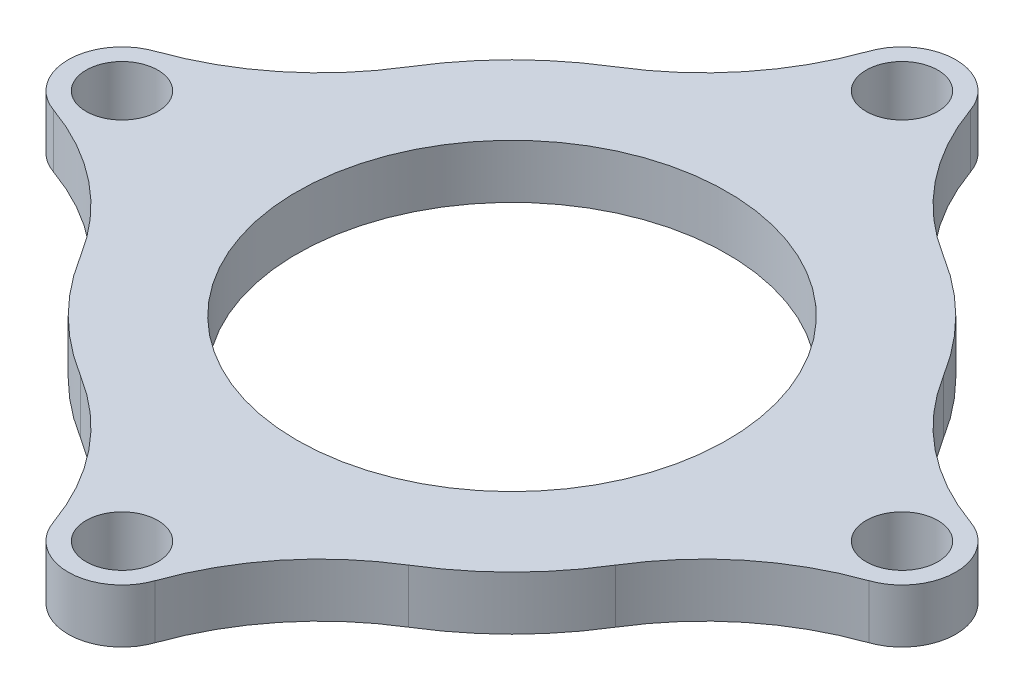
ISO-10303-21;
HEADER;
FILE_DESCRIPTION(('STEP AP214'),'2;1');
FILE_NAME('part.step','',(''),(''),'','','');
FILE_SCHEMA(('AUTOMOTIVE_DESIGN { 1 0 10303 214 1 1 1 1 }'));
ENDSEC;
DATA;
#1=APPLICATION_CONTEXT('core data for automotive mechanical design processes');
#2=APPLICATION_PROTOCOL_DEFINITION('international standard','automotive_design',2000,#1);
#3=PRODUCT_CONTEXT('',#1,'mechanical');
#4=PRODUCT('Part','Part','',(#3));
#5=PRODUCT_RELATED_PRODUCT_CATEGORY('part','',(#4));
#6=PRODUCT_DEFINITION_FORMATION('','',#4);
#7=PRODUCT_DEFINITION_CONTEXT('part definition',#1,'design');
#8=PRODUCT_DEFINITION('design','',#6,#7);
#9=PRODUCT_DEFINITION_SHAPE('','',#8);
#10=(LENGTH_UNIT() NAMED_UNIT(*) SI_UNIT(.MILLI.,.METRE.));
#11=(NAMED_UNIT(*) PLANE_ANGLE_UNIT() SI_UNIT($,.RADIAN.));
#12=(NAMED_UNIT(*) SI_UNIT($,.STERADIAN.) SOLID_ANGLE_UNIT());
#13=UNCERTAINTY_MEASURE_WITH_UNIT(LENGTH_MEASURE(1.E-05),#10,'distance_accuracy_value','');
#14=(GEOMETRIC_REPRESENTATION_CONTEXT(3) GLOBAL_UNCERTAINTY_ASSIGNED_CONTEXT((#13)) GLOBAL_UNIT_ASSIGNED_CONTEXT((#10,
#11,#12)) REPRESENTATION_CONTEXT('',''));
#15=CARTESIAN_POINT('',(0.,0.,0.));
#16=DIRECTION('',(0.,0.,1.));
#17=DIRECTION('',(1.,0.,0.));
#18=AXIS2_PLACEMENT_3D('',#15,#16,#17);
#19=CARTESIAN_POINT('',(8.49261832253294,3.,-13.8541666666667));
#20=DIRECTION('',(0.,1.,0.));
#21=DIRECTION('',(0.,0.,1.));
#22=AXIS2_PLACEMENT_3D('',#19,#20,#21);
#23=PLANE('',#22);
#24=CARTESIAN_POINT('',(0.,3.,21.75));
#25=DIRECTION('',(0.,1.,0.));
#26=DIRECTION('',(0.,0.,1.));
#27=AXIS2_PLACEMENT_3D('',#24,#25,#26);
#28=CIRCLE('',#27,2.);
#29=CARTESIAN_POINT('',(0.,3.,23.75));
#30=VERTEX_POINT('',#29);
#31=EDGE_CURVE('E347',#30,#30,#28,.T.);
#32=ORIENTED_EDGE('',*,*,#31,.F.);
#33=EDGE_LOOP('',(#32));
#34=FACE_BOUND('',#33,.T.);
#35=CARTESIAN_POINT('',(0.,3.,-21.75));
#36=DIRECTION('',(0.,1.,0.));
#37=DIRECTION('',(0.,0.,1.));
#38=AXIS2_PLACEMENT_3D('',#35,#36,#37);
#39=CIRCLE('',#38,2.);
#40=CARTESIAN_POINT('',(0.,3.,-19.75));
#41=VERTEX_POINT('',#40);
#42=EDGE_CURVE('E359',#41,#41,#39,.T.);
#43=ORIENTED_EDGE('',*,*,#42,.F.);
#44=EDGE_LOOP('',(#43));
#45=FACE_BOUND('',#44,.T.);
#46=CARTESIAN_POINT('',(16.9852366450659,3.,-27.7083333333333));
#47=DIRECTION('',(0.,-1.,0.));
#48=DIRECTION('',(0.,0.,1.));
#49=AXIS2_PLACEMENT_3D('',#46,#47,#48);
#50=CIRCLE('',#49,15.);
#51=CARTESIAN_POINT('',(9.14589665503547,3.,-14.9198717948718));
#52=VERTEX_POINT('',#51);
#53=CARTESIAN_POINT('',(2.83087277417765,3.,-22.7430555555556));
#54=VERTEX_POINT('',#53);
#55=EDGE_CURVE('E209',#52,#54,#50,.T.);
#56=ORIENTED_EDGE('',*,*,#55,.T.);
#57=CARTESIAN_POINT('',(0.,3.,-21.75));
#58=DIRECTION('',(0.,1.,0.));
#59=DIRECTION('',(0.,0.,1.));
#60=AXIS2_PLACEMENT_3D('',#57,#58,#59);
#61=CIRCLE('',#60,3.);
#62=CARTESIAN_POINT('',(-2.83087277417765,3.,-22.7430555555556));
#63=VERTEX_POINT('',#62);
#64=EDGE_CURVE('E117',#54,#63,#61,.T.);
#65=ORIENTED_EDGE('',*,*,#64,.T.);
#66=CARTESIAN_POINT('',(-16.9852366450659,3.,-27.7083333333333));
#67=DIRECTION('',(0.,-1.,0.));
#68=DIRECTION('',(0.,0.,-1.));
#69=AXIS2_PLACEMENT_3D('',#66,#67,#68);
#70=CIRCLE('',#69,15.);
#71=CARTESIAN_POINT('',(-9.14589665503547,3.,-14.9198717948718));
#72=VERTEX_POINT('',#71);
#73=EDGE_CURVE('E248',#63,#72,#70,.T.);
#74=ORIENTED_EDGE('',*,*,#73,.T.);
#75=CARTESIAN_POINT('',(0.,3.,0.));
#76=DIRECTION('',(0.,1.,0.));
#77=DIRECTION('',(0.,0.,1.));
#78=AXIS2_PLACEMENT_3D('',#75,#76,#77);
#79=CIRCLE('',#78,17.5);
#80=CARTESIAN_POINT('',(-14.9198717948718,3.,-9.14589665503547));
#81=VERTEX_POINT('',#80);
#82=EDGE_CURVE('E267',#72,#81,#79,.T.);
#83=ORIENTED_EDGE('',*,*,#82,.T.);
#84=CARTESIAN_POINT('',(-27.7083333333333,3.,-16.9852366450659));
#85=DIRECTION('',(0.,-1.,0.));
#86=DIRECTION('',(0.,0.,1.));
#87=AXIS2_PLACEMENT_3D('',#84,#85,#86);
#88=CIRCLE('',#87,15.);
#89=CARTESIAN_POINT('',(-22.7430555555556,3.,-2.83087277417764));
#90=VERTEX_POINT('',#89);
#91=EDGE_CURVE('E264',#81,#90,#88,.T.);
#92=ORIENTED_EDGE('',*,*,#91,.T.);
#93=CARTESIAN_POINT('',(-21.75,3.,0.));
#94=DIRECTION('',(0.,1.,0.));
#95=DIRECTION('',(0.,0.,1.));
#96=AXIS2_PLACEMENT_3D('',#93,#94,#95);
#97=CIRCLE('',#96,3.);
#98=CARTESIAN_POINT('',(-22.7430555555556,3.,2.83087277417765));
#99=VERTEX_POINT('',#98);
#100=EDGE_CURVE('E266',#90,#99,#97,.T.);
#101=ORIENTED_EDGE('',*,*,#100,.T.);
#102=CARTESIAN_POINT('',(-27.7083333333333,3.,16.9852366450659));
#103=DIRECTION('',(0.,-1.,0.));
#104=DIRECTION('',(0.,0.,-1.));
#105=AXIS2_PLACEMENT_3D('',#102,#103,#104);
#106=CIRCLE('',#105,15.);
#107=CARTESIAN_POINT('',(-14.9198717948718,3.,9.14589665503547));
#108=VERTEX_POINT('',#107);
#109=EDGE_CURVE('E269',#99,#108,#106,.T.);
#110=ORIENTED_EDGE('',*,*,#109,.T.);
#111=CARTESIAN_POINT('',(0.,3.,0.));
#112=DIRECTION('',(0.,1.,0.));
#113=DIRECTION('',(0.,0.,1.));
#114=AXIS2_PLACEMENT_3D('',#111,#112,#113);
#115=CIRCLE('',#114,17.5);
#116=CARTESIAN_POINT('',(-9.14589665503547,3.,14.9198717948718));
#117=VERTEX_POINT('',#116);
#118=EDGE_CURVE('E275',#108,#117,#115,.T.);
#119=ORIENTED_EDGE('',*,*,#118,.T.);
#120=CARTESIAN_POINT('',(-16.9852366450659,3.,27.7083333333333));
#121=DIRECTION('',(0.,-1.,0.));
#122=DIRECTION('',(0.,0.,1.));
#123=AXIS2_PLACEMENT_3D('',#120,#121,#122);
#124=CIRCLE('',#123,15.);
#125=CARTESIAN_POINT('',(-2.83087277417764,3.,22.7430555555556));
#126=VERTEX_POINT('',#125);
#127=EDGE_CURVE('E277',#117,#126,#124,.T.);
#128=ORIENTED_EDGE('',*,*,#127,.T.);
#129=CARTESIAN_POINT('',(0.,3.,21.75));
#130=DIRECTION('',(0.,1.,0.));
#131=DIRECTION('',(0.,0.,1.));
#132=AXIS2_PLACEMENT_3D('',#129,#130,#131);
#133=CIRCLE('',#132,3.);
#134=CARTESIAN_POINT('',(2.83087277417764,3.,22.7430555555556));
#135=VERTEX_POINT('',#134);
#136=EDGE_CURVE('E279',#126,#135,#133,.T.);
#137=ORIENTED_EDGE('',*,*,#136,.T.);
#138=CARTESIAN_POINT('',(16.9852366450659,3.,27.7083333333333));
#139=DIRECTION('',(0.,-1.,0.));
#140=DIRECTION('',(0.,0.,-1.));
#141=AXIS2_PLACEMENT_3D('',#138,#139,#140);
#142=CIRCLE('',#141,15.);
#143=CARTESIAN_POINT('',(9.14589665503547,3.,14.9198717948718));
#144=VERTEX_POINT('',#143);
#145=EDGE_CURVE('E281',#135,#144,#142,.T.);
#146=ORIENTED_EDGE('',*,*,#145,.T.);
#147=CARTESIAN_POINT('',(0.,3.,0.));
#148=DIRECTION('',(0.,1.,0.));
#149=DIRECTION('',(0.,0.,1.));
#150=AXIS2_PLACEMENT_3D('',#147,#148,#149);
#151=CIRCLE('',#150,17.5);
#152=CARTESIAN_POINT('',(14.9198717948718,3.,9.14589665503547));
#153=VERTEX_POINT('',#152);
#154=EDGE_CURVE('E283',#144,#153,#151,.T.);
#155=ORIENTED_EDGE('',*,*,#154,.T.);
#156=CARTESIAN_POINT('',(27.7083333333333,3.,16.9852366450659));
#157=DIRECTION('',(0.,-1.,0.));
#158=DIRECTION('',(0.,0.,1.));
#159=AXIS2_PLACEMENT_3D('',#156,#157,#158);
#160=CIRCLE('',#159,15.);
#161=CARTESIAN_POINT('',(22.7430555555556,3.,2.83087277417764));
#162=VERTEX_POINT('',#161);
#163=EDGE_CURVE('E160',#153,#162,#160,.T.);
#164=ORIENTED_EDGE('',*,*,#163,.T.);
#165=CARTESIAN_POINT('',(21.75,3.,0.));
#166=DIRECTION('',(0.,1.,0.));
#167=DIRECTION('',(0.,0.,1.));
#168=AXIS2_PLACEMENT_3D('',#165,#166,#167);
#169=CIRCLE('',#168,3.);
#170=CARTESIAN_POINT('',(22.7430555555556,3.,-2.83087277417764));
#171=VERTEX_POINT('',#170);
#172=EDGE_CURVE('E154',#162,#171,#169,.T.);
#173=ORIENTED_EDGE('',*,*,#172,.T.);
#174=CARTESIAN_POINT('',(27.7083333333333,3.,-16.9852366450659));
#175=DIRECTION('',(0.,-1.,0.));
#176=DIRECTION('',(0.,0.,-1.));
#177=AXIS2_PLACEMENT_3D('',#174,#175,#176);
#178=CIRCLE('',#177,15.);
#179=CARTESIAN_POINT('',(14.9198717948718,3.,-9.14589665503547));
#180=VERTEX_POINT('',#179);
#181=EDGE_CURVE('E158',#171,#180,#178,.T.);
#182=ORIENTED_EDGE('',*,*,#181,.T.);
#183=CARTESIAN_POINT('',(0.,3.,0.));
#184=DIRECTION('',(0.,1.,0.));
#185=DIRECTION('',(0.,0.,1.));
#186=AXIS2_PLACEMENT_3D('',#183,#184,#185);
#187=CIRCLE('',#186,17.5);
#188=EDGE_CURVE('E50',#180,#52,#187,.T.);
#189=ORIENTED_EDGE('',*,*,#188,.T.);
#190=EDGE_LOOP('',(#56,#65,#74,#83,#92,#101,#110,#119,#128,#137,#146,#155,#164,#173,#182,#189));
#191=FACE_BOUND('',#190,.T.);
#192=CARTESIAN_POINT('',(0.,3.,0.));
#193=DIRECTION('',(0.,1.,0.));
#194=DIRECTION('',(0.,0.,1.));
#195=AXIS2_PLACEMENT_3D('',#192,#193,#194);
#196=CIRCLE('',#195,12.);
#197=CARTESIAN_POINT('',(0.,3.,12.));
#198=VERTEX_POINT('',#197);
#199=EDGE_CURVE('E182',#198,#198,#196,.T.);
#200=ORIENTED_EDGE('',*,*,#199,.F.);
#201=EDGE_LOOP('',(#200));
#202=FACE_BOUND('',#201,.T.);
#203=CARTESIAN_POINT('',(21.75,3.,0.));
#204=DIRECTION('',(0.,1.,0.));
#205=DIRECTION('',(0.,0.,1.));
#206=AXIS2_PLACEMENT_3D('',#203,#204,#205);
#207=CIRCLE('',#206,2.);
#208=CARTESIAN_POINT('',(21.75,3.,2.));
#209=VERTEX_POINT('',#208);
#210=EDGE_CURVE('E353',#209,#209,#207,.T.);
#211=ORIENTED_EDGE('',*,*,#210,.F.);
#212=EDGE_LOOP('',(#211));
#213=FACE_BOUND('',#212,.T.);
#214=CARTESIAN_POINT('',(-21.75,3.,0.));
#215=DIRECTION('',(0.,1.,0.));
#216=DIRECTION('',(0.,0.,1.));
#217=AXIS2_PLACEMENT_3D('',#214,#215,#216);
#218=CIRCLE('',#217,2.);
#219=CARTESIAN_POINT('',(-21.75,3.,2.));
#220=VERTEX_POINT('',#219);
#221=EDGE_CURVE('E338',#220,#220,#218,.T.);
#222=ORIENTED_EDGE('',*,*,#221,.F.);
#223=EDGE_LOOP('',(#222));
#224=FACE_BOUND('',#223,.T.);
#225=ADVANCED_FACE('F33',(#34,#45,#191,#202,#213,#224),#23,.T.);
#226=CARTESIAN_POINT('',(8.49261832253294,0.,-13.8541666666667));
#227=DIRECTION('',(0.,1.,0.));
#228=DIRECTION('',(0.,0.,1.));
#229=AXIS2_PLACEMENT_3D('',#226,#227,#228);
#230=PLANE('',#229);
#231=CARTESIAN_POINT('',(16.9852366450659,0.,-27.7083333333333));
#232=DIRECTION('',(0.,-1.,0.));
#233=DIRECTION('',(0.,0.,1.));
#234=AXIS2_PLACEMENT_3D('',#231,#232,#233);
#235=CIRCLE('',#234,15.);
#236=CARTESIAN_POINT('',(9.14589665503547,0.,-14.9198717948718));
#237=VERTEX_POINT('',#236);
#238=CARTESIAN_POINT('',(2.83087277417765,0.,-22.7430555555556));
#239=VERTEX_POINT('',#238);
#240=EDGE_CURVE('E178',#237,#239,#235,.T.);
#241=ORIENTED_EDGE('',*,*,#240,.F.);
#242=CARTESIAN_POINT('',(0.,0.,0.));
#243=DIRECTION('',(0.,1.,0.));
#244=DIRECTION('',(0.,0.,1.));
#245=AXIS2_PLACEMENT_3D('',#242,#243,#244);
#246=CIRCLE('',#245,17.5);
#247=CARTESIAN_POINT('',(14.9198717948718,0.,-9.14589665503547));
#248=VERTEX_POINT('',#247);
#249=EDGE_CURVE('E109',#248,#237,#246,.T.);
#250=ORIENTED_EDGE('',*,*,#249,.F.);
#251=CARTESIAN_POINT('',(27.7083333333333,0.,-16.9852366450659));
#252=DIRECTION('',(0.,-1.,0.));
#253=DIRECTION('',(0.,0.,-1.));
#254=AXIS2_PLACEMENT_3D('',#251,#252,#253);
#255=CIRCLE('',#254,15.);
#256=CARTESIAN_POINT('',(22.7430555555556,0.,-2.83087277417764));
#257=VERTEX_POINT('',#256);
#258=EDGE_CURVE('E103',#257,#248,#255,.T.);
#259=ORIENTED_EDGE('',*,*,#258,.F.);
#260=CARTESIAN_POINT('',(21.75,0.,0.));
#261=DIRECTION('',(0.,1.,0.));
#262=DIRECTION('',(0.,0.,1.));
#263=AXIS2_PLACEMENT_3D('',#260,#261,#262);
#264=CIRCLE('',#263,3.);
#265=CARTESIAN_POINT('',(22.7430555555556,0.,2.83087277417764));
#266=VERTEX_POINT('',#265);
#267=EDGE_CURVE('E168',#266,#257,#264,.T.);
#268=ORIENTED_EDGE('',*,*,#267,.F.);
#269=CARTESIAN_POINT('',(27.7083333333333,0.,16.9852366450659));
#270=DIRECTION('',(0.,-1.,0.));
#271=DIRECTION('',(0.,0.,1.));
#272=AXIS2_PLACEMENT_3D('',#269,#270,#271);
#273=CIRCLE('',#272,15.);
#274=CARTESIAN_POINT('',(14.9198717948718,0.,9.14589665503547));
#275=VERTEX_POINT('',#274);
#276=EDGE_CURVE('E204',#275,#266,#273,.T.);
#277=ORIENTED_EDGE('',*,*,#276,.F.);
#278=CARTESIAN_POINT('',(0.,0.,0.));
#279=DIRECTION('',(0.,1.,0.));
#280=DIRECTION('',(0.,0.,1.));
#281=AXIS2_PLACEMENT_3D('',#278,#279,#280);
#282=CIRCLE('',#281,17.5);
#283=CARTESIAN_POINT('',(9.14589665503547,0.,14.9198717948718));
#284=VERTEX_POINT('',#283);
#285=EDGE_CURVE('E202',#284,#275,#282,.T.);
#286=ORIENTED_EDGE('',*,*,#285,.F.);
#287=CARTESIAN_POINT('',(16.9852366450659,0.,27.7083333333333));
#288=DIRECTION('',(0.,-1.,0.));
#289=DIRECTION('',(0.,0.,-1.));
#290=AXIS2_PLACEMENT_3D('',#287,#288,#289);
#291=CIRCLE('',#290,15.);
#292=CARTESIAN_POINT('',(2.83087277417764,0.,22.7430555555556));
#293=VERTEX_POINT('',#292);
#294=EDGE_CURVE('E200',#293,#284,#291,.T.);
#295=ORIENTED_EDGE('',*,*,#294,.F.);
#296=CARTESIAN_POINT('',(0.,0.,21.75));
#297=DIRECTION('',(0.,1.,0.));
#298=DIRECTION('',(0.,0.,1.));
#299=AXIS2_PLACEMENT_3D('',#296,#297,#298);
#300=CIRCLE('',#299,3.);
#301=CARTESIAN_POINT('',(-2.83087277417764,0.,22.7430555555556));
#302=VERTEX_POINT('',#301);
#303=EDGE_CURVE('E198',#302,#293,#300,.T.);
#304=ORIENTED_EDGE('',*,*,#303,.F.);
#305=CARTESIAN_POINT('',(-16.9852366450659,0.,27.7083333333333));
#306=DIRECTION('',(0.,-1.,0.));
#307=DIRECTION('',(0.,0.,1.));
#308=AXIS2_PLACEMENT_3D('',#305,#306,#307);
#309=CIRCLE('',#308,15.);
#310=CARTESIAN_POINT('',(-9.14589665503547,0.,14.9198717948718));
#311=VERTEX_POINT('',#310);
#312=EDGE_CURVE('E196',#311,#302,#309,.T.);
#313=ORIENTED_EDGE('',*,*,#312,.F.);
#314=CARTESIAN_POINT('',(0.,0.,0.));
#315=DIRECTION('',(0.,1.,0.));
#316=DIRECTION('',(0.,0.,1.));
#317=AXIS2_PLACEMENT_3D('',#314,#315,#316);
#318=CIRCLE('',#317,17.5);
#319=CARTESIAN_POINT('',(-14.9198717948718,0.,9.14589665503547));
#320=VERTEX_POINT('',#319);
#321=EDGE_CURVE('E194',#320,#311,#318,.T.);
#322=ORIENTED_EDGE('',*,*,#321,.F.);
#323=CARTESIAN_POINT('',(-27.7083333333333,0.,16.9852366450659));
#324=DIRECTION('',(0.,-1.,0.));
#325=DIRECTION('',(0.,0.,-1.));
#326=AXIS2_PLACEMENT_3D('',#323,#324,#325);
#327=CIRCLE('',#326,15.);
#328=CARTESIAN_POINT('',(-22.7430555555556,0.,2.83087277417765));
#329=VERTEX_POINT('',#328);
#330=EDGE_CURVE('E192',#329,#320,#327,.T.);
#331=ORIENTED_EDGE('',*,*,#330,.F.);
#332=CARTESIAN_POINT('',(-21.75,0.,0.));
#333=DIRECTION('',(0.,1.,0.));
#334=DIRECTION('',(0.,0.,1.));
#335=AXIS2_PLACEMENT_3D('',#332,#333,#334);
#336=CIRCLE('',#335,3.);
#337=CARTESIAN_POINT('',(-22.7430555555556,0.,-2.83087277417764));
#338=VERTEX_POINT('',#337);
#339=EDGE_CURVE('E190',#338,#329,#336,.T.);
#340=ORIENTED_EDGE('',*,*,#339,.F.);
#341=CARTESIAN_POINT('',(-27.7083333333333,0.,-16.9852366450659));
#342=DIRECTION('',(0.,-1.,0.));
#343=DIRECTION('',(0.,0.,1.));
#344=AXIS2_PLACEMENT_3D('',#341,#342,#343);
#345=CIRCLE('',#344,15.);
#346=CARTESIAN_POINT('',(-14.9198717948718,0.,-9.14589665503547));
#347=VERTEX_POINT('',#346);
#348=EDGE_CURVE('E188',#347,#338,#345,.T.);
#349=ORIENTED_EDGE('',*,*,#348,.F.);
#350=CARTESIAN_POINT('',(0.,0.,0.));
#351=DIRECTION('',(0.,1.,0.));
#352=DIRECTION('',(0.,0.,1.));
#353=AXIS2_PLACEMENT_3D('',#350,#351,#352);
#354=CIRCLE('',#353,17.5);
#355=CARTESIAN_POINT('',(-9.14589665503547,0.,-14.9198717948718));
#356=VERTEX_POINT('',#355);
#357=EDGE_CURVE('E186',#356,#347,#354,.T.);
#358=ORIENTED_EDGE('',*,*,#357,.F.);
#359=CARTESIAN_POINT('',(-16.9852366450659,0.,-27.7083333333333));
#360=DIRECTION('',(0.,-1.,0.));
#361=DIRECTION('',(0.,0.,-1.));
#362=AXIS2_PLACEMENT_3D('',#359,#360,#361);
#363=CIRCLE('',#362,15.);
#364=CARTESIAN_POINT('',(-2.83087277417765,0.,-22.7430555555556));
#365=VERTEX_POINT('',#364);
#366=EDGE_CURVE('E184',#365,#356,#363,.T.);
#367=ORIENTED_EDGE('',*,*,#366,.F.);
#368=CARTESIAN_POINT('',(0.,0.,-21.75));
#369=DIRECTION('',(0.,1.,0.));
#370=DIRECTION('',(0.,0.,1.));
#371=AXIS2_PLACEMENT_3D('',#368,#369,#370);
#372=CIRCLE('',#371,3.);
#373=EDGE_CURVE('E181',#239,#365,#372,.T.);
#374=ORIENTED_EDGE('',*,*,#373,.F.);
#375=EDGE_LOOP('',(#241,#250,#259,#268,#277,#286,#295,#304,#313,#322,#331,#340,#349,#358,#367,#374));
#376=FACE_BOUND('',#375,.T.);
#377=CARTESIAN_POINT('',(0.,0.,0.));
#378=DIRECTION('',(0.,1.,0.));
#379=DIRECTION('',(0.,0.,1.));
#380=AXIS2_PLACEMENT_3D('',#377,#378,#379);
#381=CIRCLE('',#380,12.);
#382=CARTESIAN_POINT('',(0.,0.,12.));
#383=VERTEX_POINT('',#382);
#384=EDGE_CURVE('E362',#383,#383,#381,.T.);
#385=ORIENTED_EDGE('',*,*,#384,.T.);
#386=EDGE_LOOP('',(#385));
#387=FACE_BOUND('',#386,.T.);
#388=CARTESIAN_POINT('',(0.,0.,-21.75));
#389=DIRECTION('',(0.,1.,0.));
#390=DIRECTION('',(0.,0.,1.));
#391=AXIS2_PLACEMENT_3D('',#388,#389,#390);
#392=CIRCLE('',#391,2.);
#393=CARTESIAN_POINT('',(0.,0.,-19.75));
#394=VERTEX_POINT('',#393);
#395=EDGE_CURVE('E356',#394,#394,#392,.T.);
#396=ORIENTED_EDGE('',*,*,#395,.T.);
#397=EDGE_LOOP('',(#396));
#398=FACE_BOUND('',#397,.T.);
#399=CARTESIAN_POINT('',(21.75,0.,0.));
#400=DIRECTION('',(0.,1.,0.));
#401=DIRECTION('',(0.,0.,1.));
#402=AXIS2_PLACEMENT_3D('',#399,#400,#401);
#403=CIRCLE('',#402,2.);
#404=CARTESIAN_POINT('',(21.75,0.,2.));
#405=VERTEX_POINT('',#404);
#406=EDGE_CURVE('E350',#405,#405,#403,.T.);
#407=ORIENTED_EDGE('',*,*,#406,.T.);
#408=EDGE_LOOP('',(#407));
#409=FACE_BOUND('',#408,.T.);
#410=CARTESIAN_POINT('',(0.,0.,21.75));
#411=DIRECTION('',(0.,1.,0.));
#412=DIRECTION('',(0.,0.,1.));
#413=AXIS2_PLACEMENT_3D('',#410,#411,#412);
#414=CIRCLE('',#413,2.);
#415=CARTESIAN_POINT('',(0.,0.,23.75));
#416=VERTEX_POINT('',#415);
#417=EDGE_CURVE('E344',#416,#416,#414,.T.);
#418=ORIENTED_EDGE('',*,*,#417,.T.);
#419=EDGE_LOOP('',(#418));
#420=FACE_BOUND('',#419,.T.);
#421=CARTESIAN_POINT('',(-21.75,0.,0.));
#422=DIRECTION('',(0.,1.,0.));
#423=DIRECTION('',(0.,0.,1.));
#424=AXIS2_PLACEMENT_3D('',#421,#422,#423);
#425=CIRCLE('',#424,2.);
#426=CARTESIAN_POINT('',(-21.75,0.,2.));
#427=VERTEX_POINT('',#426);
#428=EDGE_CURVE('E341',#427,#427,#425,.T.);
#429=ORIENTED_EDGE('',*,*,#428,.T.);
#430=EDGE_LOOP('',(#429));
#431=FACE_BOUND('',#430,.T.);
#432=ADVANCED_FACE('F252',(#376,#387,#398,#409,#420,#431),#230,.F.);
#433=CARTESIAN_POINT('',(16.9852366450659,3.,-27.7083333333333));
#434=DIRECTION('',(0.,-1.,0.));
#435=DIRECTION('',(0.,0.,-1.));
#436=AXIS2_PLACEMENT_3D('',#433,#434,#435);
#437=CYLINDRICAL_SURFACE('',#436,15.);
#438=ORIENTED_EDGE('',*,*,#240,.T.);
#439=DIRECTION('',(0.,-1.,0.));
#440=VECTOR('',#439,1.);
#441=CARTESIAN_POINT('',(2.83087277417765,3.,-22.7430555555556));
#442=LINE('',#441,#440);
#443=EDGE_CURVE('E11',#54,#239,#442,.T.);
#444=ORIENTED_EDGE('',*,*,#443,.F.);
#445=ORIENTED_EDGE('',*,*,#55,.F.);
#446=DIRECTION('',(0.,-1.,0.));
#447=VECTOR('',#446,1.);
#448=CARTESIAN_POINT('',(9.14589665503547,3.,-14.9198717948718));
#449=LINE('',#448,#447);
#450=EDGE_CURVE('E174',#52,#237,#449,.T.);
#451=ORIENTED_EDGE('',*,*,#450,.T.);
#452=EDGE_LOOP('',(#438,#444,#445,#451));
#453=FACE_BOUND('',#452,.T.);
#454=ADVANCED_FACE('F35',(#453),#437,.F.);
#455=CARTESIAN_POINT('',(0.,3.,-21.75));
#456=DIRECTION('',(0.,-1.,0.));
#457=DIRECTION('',(0.,0.,-1.));
#458=AXIS2_PLACEMENT_3D('',#455,#456,#457);
#459=CYLINDRICAL_SURFACE('',#458,3.);
#460=ORIENTED_EDGE('',*,*,#373,.T.);
#461=DIRECTION('',(0.,-1.,0.));
#462=VECTOR('',#461,1.);
#463=CARTESIAN_POINT('',(-2.83087277417765,3.,-22.7430555555556));
#464=LINE('',#463,#462);
#465=EDGE_CURVE('E42',#63,#365,#464,.T.);
#466=ORIENTED_EDGE('',*,*,#465,.F.);
#467=ORIENTED_EDGE('',*,*,#64,.F.);
#468=ORIENTED_EDGE('',*,*,#443,.T.);
#469=EDGE_LOOP('',(#460,#466,#467,#468));
#470=FACE_BOUND('',#469,.T.);
#471=ADVANCED_FACE('F521',(#470),#459,.T.);
#472=CARTESIAN_POINT('',(-16.9852366450659,3.,-27.7083333333333));
#473=DIRECTION('',(0.,-1.,0.));
#474=DIRECTION('',(0.,0.,-1.));
#475=AXIS2_PLACEMENT_3D('',#472,#473,#474);
#476=CYLINDRICAL_SURFACE('',#475,15.);
#477=ORIENTED_EDGE('',*,*,#366,.T.);
#478=DIRECTION('',(0.,-1.,0.));
#479=VECTOR('',#478,1.);
#480=CARTESIAN_POINT('',(-9.14589665503547,3.,-14.9198717948718));
#481=LINE('',#480,#479);
#482=EDGE_CURVE('E240',#72,#356,#481,.T.);
#483=ORIENTED_EDGE('',*,*,#482,.F.);
#484=ORIENTED_EDGE('',*,*,#73,.F.);
#485=ORIENTED_EDGE('',*,*,#465,.T.);
#486=EDGE_LOOP('',(#477,#483,#484,#485));
#487=FACE_BOUND('',#486,.T.);
#488=ADVANCED_FACE('F246',(#487),#476,.F.);
#489=CARTESIAN_POINT('',(0.,3.,0.));
#490=DIRECTION('',(0.,-1.,0.));
#491=DIRECTION('',(0.,0.,-1.));
#492=AXIS2_PLACEMENT_3D('',#489,#490,#491);
#493=CYLINDRICAL_SURFACE('',#492,17.5);
#494=ORIENTED_EDGE('',*,*,#357,.T.);
#495=DIRECTION('',(0.,-1.,0.));
#496=VECTOR('',#495,1.);
#497=CARTESIAN_POINT('',(-14.9198717948718,3.,-9.14589665503547));
#498=LINE('',#497,#496);
#499=EDGE_CURVE('E237',#81,#347,#498,.T.);
#500=ORIENTED_EDGE('',*,*,#499,.F.);
#501=ORIENTED_EDGE('',*,*,#82,.F.);
#502=ORIENTED_EDGE('',*,*,#482,.T.);
#503=EDGE_LOOP('',(#494,#500,#501,#502));
#504=FACE_BOUND('',#503,.T.);
#505=ADVANCED_FACE('F258',(#504),#493,.T.);
#506=CARTESIAN_POINT('',(-27.7083333333333,3.,-16.9852366450659));
#507=DIRECTION('',(0.,-1.,0.));
#508=DIRECTION('',(0.,0.,-1.));
#509=AXIS2_PLACEMENT_3D('',#506,#507,#508);
#510=CYLINDRICAL_SURFACE('',#509,15.);
#511=ORIENTED_EDGE('',*,*,#348,.T.);
#512=DIRECTION('',(0.,-1.,0.));
#513=VECTOR('',#512,1.);
#514=CARTESIAN_POINT('',(-22.7430555555556,3.,-2.83087277417764));
#515=LINE('',#514,#513);
#516=EDGE_CURVE('E234',#90,#338,#515,.T.);
#517=ORIENTED_EDGE('',*,*,#516,.F.);
#518=ORIENTED_EDGE('',*,*,#91,.F.);
#519=ORIENTED_EDGE('',*,*,#499,.T.);
#520=EDGE_LOOP('',(#511,#517,#518,#519));
#521=FACE_BOUND('',#520,.T.);
#522=ADVANCED_FACE('F262',(#521),#510,.F.);
#523=CARTESIAN_POINT('',(-21.75,3.,0.));
#524=DIRECTION('',(0.,-1.,0.));
#525=DIRECTION('',(0.,0.,-1.));
#526=AXIS2_PLACEMENT_3D('',#523,#524,#525);
#527=CYLINDRICAL_SURFACE('',#526,3.);
#528=ORIENTED_EDGE('',*,*,#339,.T.);
#529=DIRECTION('',(0.,-1.,0.));
#530=VECTOR('',#529,1.);
#531=CARTESIAN_POINT('',(-22.7430555555556,3.,2.83087277417765));
#532=LINE('',#531,#530);
#533=EDGE_CURVE('E231',#99,#329,#532,.T.);
#534=ORIENTED_EDGE('',*,*,#533,.F.);
#535=ORIENTED_EDGE('',*,*,#100,.F.);
#536=ORIENTED_EDGE('',*,*,#516,.T.);
#537=EDGE_LOOP('',(#528,#534,#535,#536));
#538=FACE_BOUND('',#537,.T.);
#539=ADVANCED_FACE('F486',(#538),#527,.T.);
#540=CARTESIAN_POINT('',(-27.7083333333333,3.,16.9852366450659));
#541=DIRECTION('',(0.,-1.,0.));
#542=DIRECTION('',(0.,0.,-1.));
#543=AXIS2_PLACEMENT_3D('',#540,#541,#542);
#544=CYLINDRICAL_SURFACE('',#543,15.);
#545=ORIENTED_EDGE('',*,*,#330,.T.);
#546=DIRECTION('',(0.,-1.,0.));
#547=VECTOR('',#546,1.);
#548=CARTESIAN_POINT('',(-14.9198717948718,3.,9.14589665503547));
#549=LINE('',#548,#547);
#550=EDGE_CURVE('E228',#108,#320,#549,.T.);
#551=ORIENTED_EDGE('',*,*,#550,.F.);
#552=ORIENTED_EDGE('',*,*,#109,.F.);
#553=ORIENTED_EDGE('',*,*,#533,.T.);
#554=EDGE_LOOP('',(#545,#551,#552,#553));
#555=FACE_BOUND('',#554,.T.);
#556=ADVANCED_FACE('F476',(#555),#544,.F.);
#557=CARTESIAN_POINT('',(0.,3.,0.));
#558=DIRECTION('',(0.,-1.,0.));
#559=DIRECTION('',(0.,0.,-1.));
#560=AXIS2_PLACEMENT_3D('',#557,#558,#559);
#561=CYLINDRICAL_SURFACE('',#560,17.5);
#562=ORIENTED_EDGE('',*,*,#321,.T.);
#563=DIRECTION('',(0.,-1.,0.));
#564=VECTOR('',#563,1.);
#565=CARTESIAN_POINT('',(-9.14589665503547,3.,14.9198717948718));
#566=LINE('',#565,#564);
#567=EDGE_CURVE('E225',#117,#311,#566,.T.);
#568=ORIENTED_EDGE('',*,*,#567,.F.);
#569=ORIENTED_EDGE('',*,*,#118,.F.);
#570=ORIENTED_EDGE('',*,*,#550,.T.);
#571=EDGE_LOOP('',(#562,#568,#569,#570));
#572=FACE_BOUND('',#571,.T.);
#573=ADVANCED_FACE('F466',(#572),#561,.T.);
#574=CARTESIAN_POINT('',(-16.9852366450659,3.,27.7083333333333));
#575=DIRECTION('',(0.,-1.,0.));
#576=DIRECTION('',(0.,0.,-1.));
#577=AXIS2_PLACEMENT_3D('',#574,#575,#576);
#578=CYLINDRICAL_SURFACE('',#577,15.);
#579=ORIENTED_EDGE('',*,*,#312,.T.);
#580=DIRECTION('',(0.,-1.,0.));
#581=VECTOR('',#580,1.);
#582=CARTESIAN_POINT('',(-2.83087277417764,3.,22.7430555555556));
#583=LINE('',#582,#581);
#584=EDGE_CURVE('E222',#126,#302,#583,.T.);
#585=ORIENTED_EDGE('',*,*,#584,.F.);
#586=ORIENTED_EDGE('',*,*,#127,.F.);
#587=ORIENTED_EDGE('',*,*,#567,.T.);
#588=EDGE_LOOP('',(#579,#585,#586,#587));
#589=FACE_BOUND('',#588,.T.);
#590=ADVANCED_FACE('F456',(#589),#578,.F.);
#591=CARTESIAN_POINT('',(0.,3.,21.75));
#592=DIRECTION('',(0.,-1.,0.));
#593=DIRECTION('',(0.,0.,-1.));
#594=AXIS2_PLACEMENT_3D('',#591,#592,#593);
#595=CYLINDRICAL_SURFACE('',#594,3.);
#596=ORIENTED_EDGE('',*,*,#303,.T.);
#597=DIRECTION('',(0.,-1.,0.));
#598=VECTOR('',#597,1.);
#599=CARTESIAN_POINT('',(2.83087277417764,3.,22.7430555555556));
#600=LINE('',#599,#598);
#601=EDGE_CURVE('E219',#135,#293,#600,.T.);
#602=ORIENTED_EDGE('',*,*,#601,.F.);
#603=ORIENTED_EDGE('',*,*,#136,.F.);
#604=ORIENTED_EDGE('',*,*,#584,.T.);
#605=EDGE_LOOP('',(#596,#602,#603,#604));
#606=FACE_BOUND('',#605,.T.);
#607=ADVANCED_FACE('F446',(#606),#595,.T.);
#608=CARTESIAN_POINT('',(16.9852366450659,3.,27.7083333333333));
#609=DIRECTION('',(0.,-1.,0.));
#610=DIRECTION('',(0.,0.,-1.));
#611=AXIS2_PLACEMENT_3D('',#608,#609,#610);
#612=CYLINDRICAL_SURFACE('',#611,15.);
#613=ORIENTED_EDGE('',*,*,#294,.T.);
#614=DIRECTION('',(0.,-1.,0.));
#615=VECTOR('',#614,1.);
#616=CARTESIAN_POINT('',(9.14589665503547,3.,14.9198717948718));
#617=LINE('',#616,#615);
#618=EDGE_CURVE('E216',#144,#284,#617,.T.);
#619=ORIENTED_EDGE('',*,*,#618,.F.);
#620=ORIENTED_EDGE('',*,*,#145,.F.);
#621=ORIENTED_EDGE('',*,*,#601,.T.);
#622=EDGE_LOOP('',(#613,#619,#620,#621));
#623=FACE_BOUND('',#622,.T.);
#624=ADVANCED_FACE('F437',(#623),#612,.F.);
#625=CARTESIAN_POINT('',(0.,3.,0.));
#626=DIRECTION('',(0.,-1.,0.));
#627=DIRECTION('',(0.,0.,-1.));
#628=AXIS2_PLACEMENT_3D('',#625,#626,#627);
#629=CYLINDRICAL_SURFACE('',#628,17.5);
#630=ORIENTED_EDGE('',*,*,#285,.T.);
#631=DIRECTION('',(0.,-1.,0.));
#632=VECTOR('',#631,1.);
#633=CARTESIAN_POINT('',(14.9198717948718,3.,9.14589665503547));
#634=LINE('',#633,#632);
#635=EDGE_CURVE('E213',#153,#275,#634,.T.);
#636=ORIENTED_EDGE('',*,*,#635,.F.);
#637=ORIENTED_EDGE('',*,*,#154,.F.);
#638=ORIENTED_EDGE('',*,*,#618,.T.);
#639=EDGE_LOOP('',(#630,#636,#637,#638));
#640=FACE_BOUND('',#639,.T.);
#641=ADVANCED_FACE('F289',(#640),#629,.T.);
#642=CARTESIAN_POINT('',(27.7083333333333,3.,16.9852366450659));
#643=DIRECTION('',(0.,-1.,0.));
#644=DIRECTION('',(0.,0.,-1.));
#645=AXIS2_PLACEMENT_3D('',#642,#643,#644);
#646=CYLINDRICAL_SURFACE('',#645,15.);
#647=ORIENTED_EDGE('',*,*,#276,.T.);
#648=DIRECTION('',(0.,-1.,0.));
#649=VECTOR('',#648,1.);
#650=CARTESIAN_POINT('',(22.7430555555556,3.,2.83087277417764));
#651=LINE('',#650,#649);
#652=EDGE_CURVE('E169',#162,#266,#651,.T.);
#653=ORIENTED_EDGE('',*,*,#652,.F.);
#654=ORIENTED_EDGE('',*,*,#163,.F.);
#655=ORIENTED_EDGE('',*,*,#635,.T.);
#656=EDGE_LOOP('',(#647,#653,#654,#655));
#657=FACE_BOUND('',#656,.T.);
#658=ADVANCED_FACE('F293',(#657),#646,.F.);
#659=CARTESIAN_POINT('',(21.75,3.,0.));
#660=DIRECTION('',(0.,-1.,0.));
#661=DIRECTION('',(0.,0.,-1.));
#662=AXIS2_PLACEMENT_3D('',#659,#660,#661);
#663=CYLINDRICAL_SURFACE('',#662,3.);
#664=ORIENTED_EDGE('',*,*,#267,.T.);
#665=DIRECTION('',(0.,-1.,0.));
#666=VECTOR('',#665,1.);
#667=CARTESIAN_POINT('',(22.7430555555556,3.,-2.83087277417764));
#668=LINE('',#667,#666);
#669=EDGE_CURVE('E165',#171,#257,#668,.T.);
#670=ORIENTED_EDGE('',*,*,#669,.F.);
#671=ORIENTED_EDGE('',*,*,#172,.F.);
#672=ORIENTED_EDGE('',*,*,#652,.T.);
#673=EDGE_LOOP('',(#664,#670,#671,#672));
#674=FACE_BOUND('',#673,.T.);
#675=ADVANCED_FACE('F166',(#674),#663,.T.);
#676=CARTESIAN_POINT('',(27.7083333333333,3.,-16.9852366450659));
#677=DIRECTION('',(0.,-1.,0.));
#678=DIRECTION('',(0.,0.,-1.));
#679=AXIS2_PLACEMENT_3D('',#676,#677,#678);
#680=CYLINDRICAL_SURFACE('',#679,15.);
#681=ORIENTED_EDGE('',*,*,#258,.T.);
#682=DIRECTION('',(0.,-1.,0.));
#683=VECTOR('',#682,1.);
#684=CARTESIAN_POINT('',(14.9198717948718,3.,-9.14589665503547));
#685=LINE('',#684,#683);
#686=EDGE_CURVE('E170',#180,#248,#685,.T.);
#687=ORIENTED_EDGE('',*,*,#686,.F.);
#688=ORIENTED_EDGE('',*,*,#181,.F.);
#689=ORIENTED_EDGE('',*,*,#669,.T.);
#690=EDGE_LOOP('',(#681,#687,#688,#689));
#691=FACE_BOUND('',#690,.T.);
#692=ADVANCED_FACE('F172',(#691),#680,.F.);
#693=CARTESIAN_POINT('',(0.,3.,0.));
#694=DIRECTION('',(0.,-1.,0.));
#695=DIRECTION('',(0.,0.,-1.));
#696=AXIS2_PLACEMENT_3D('',#693,#694,#695);
#697=CYLINDRICAL_SURFACE('',#696,17.5);
#698=ORIENTED_EDGE('',*,*,#249,.T.);
#699=ORIENTED_EDGE('',*,*,#450,.F.);
#700=ORIENTED_EDGE('',*,*,#188,.F.);
#701=ORIENTED_EDGE('',*,*,#686,.T.);
#702=EDGE_LOOP('',(#698,#699,#700,#701));
#703=FACE_BOUND('',#702,.T.);
#704=ADVANCED_FACE('F297',(#703),#697,.T.);
#705=CARTESIAN_POINT('',(0.,3.,0.));
#706=DIRECTION('',(0.,-1.,0.));
#707=DIRECTION('',(0.,0.,-1.));
#708=AXIS2_PLACEMENT_3D('',#705,#706,#707);
#709=CYLINDRICAL_SURFACE('',#708,12.);
#710=ORIENTED_EDGE('',*,*,#199,.T.);
#711=EDGE_LOOP('',(#710));
#712=FACE_BOUND('',#711,.T.);
#713=ORIENTED_EDGE('',*,*,#384,.F.);
#714=EDGE_LOOP('',(#713));
#715=FACE_BOUND('',#714,.T.);
#716=ADVANCED_FACE('F299',(#712,#715),#709,.F.);
#717=CARTESIAN_POINT('',(0.,3.,-21.75));
#718=DIRECTION('',(0.,-1.,0.));
#719=DIRECTION('',(0.,0.,-1.));
#720=AXIS2_PLACEMENT_3D('',#717,#718,#719);
#721=CYLINDRICAL_SURFACE('',#720,2.);
#722=ORIENTED_EDGE('',*,*,#42,.T.);
#723=EDGE_LOOP('',(#722));
#724=FACE_BOUND('',#723,.T.);
#725=ORIENTED_EDGE('',*,*,#395,.F.);
#726=EDGE_LOOP('',(#725));
#727=FACE_BOUND('',#726,.T.);
#728=ADVANCED_FACE('F305',(#724,#727),#721,.F.);
#729=CARTESIAN_POINT('',(21.75,3.,0.));
#730=DIRECTION('',(0.,-1.,0.));
#731=DIRECTION('',(0.,0.,-1.));
#732=AXIS2_PLACEMENT_3D('',#729,#730,#731);
#733=CYLINDRICAL_SURFACE('',#732,2.);
#734=ORIENTED_EDGE('',*,*,#210,.T.);
#735=EDGE_LOOP('',(#734));
#736=FACE_BOUND('',#735,.T.);
#737=ORIENTED_EDGE('',*,*,#406,.F.);
#738=EDGE_LOOP('',(#737));
#739=FACE_BOUND('',#738,.T.);
#740=ADVANCED_FACE('F321',(#736,#739),#733,.F.);
#741=CARTESIAN_POINT('',(0.,3.,21.75));
#742=DIRECTION('',(0.,-1.,0.));
#743=DIRECTION('',(0.,0.,-1.));
#744=AXIS2_PLACEMENT_3D('',#741,#742,#743);
#745=CYLINDRICAL_SURFACE('',#744,2.);
#746=ORIENTED_EDGE('',*,*,#31,.T.);
#747=EDGE_LOOP('',(#746));
#748=FACE_BOUND('',#747,.T.);
#749=ORIENTED_EDGE('',*,*,#417,.F.);
#750=EDGE_LOOP('',(#749));
#751=FACE_BOUND('',#750,.T.);
#752=ADVANCED_FACE('F325',(#748,#751),#745,.F.);
#753=CARTESIAN_POINT('',(-21.75,3.,0.));
#754=DIRECTION('',(0.,-1.,0.));
#755=DIRECTION('',(0.,0.,-1.));
#756=AXIS2_PLACEMENT_3D('',#753,#754,#755);
#757=CYLINDRICAL_SURFACE('',#756,2.);
#758=ORIENTED_EDGE('',*,*,#221,.T.);
#759=EDGE_LOOP('',(#758));
#760=FACE_BOUND('',#759,.T.);
#761=ORIENTED_EDGE('',*,*,#428,.F.);
#762=EDGE_LOOP('',(#761));
#763=FACE_BOUND('',#762,.T.);
#764=ADVANCED_FACE('F329',(#760,#763),#757,.F.);
#765=CLOSED_SHELL('',(#225,#432,#454,#471,#488,#505,#522,#539,#556,#573,#590,#607,#624,#641,
#658,#675,#692,#704,#716,#728,#740,#752,#764));
#766=MANIFOLD_SOLID_BREP('B2',#765);
#767=ADVANCED_BREP_SHAPE_REPRESENTATION('',(#18,#766),#14);
#768=SHAPE_DEFINITION_REPRESENTATION(#9,#767);
ENDSEC;
END-ISO-10303-21;
